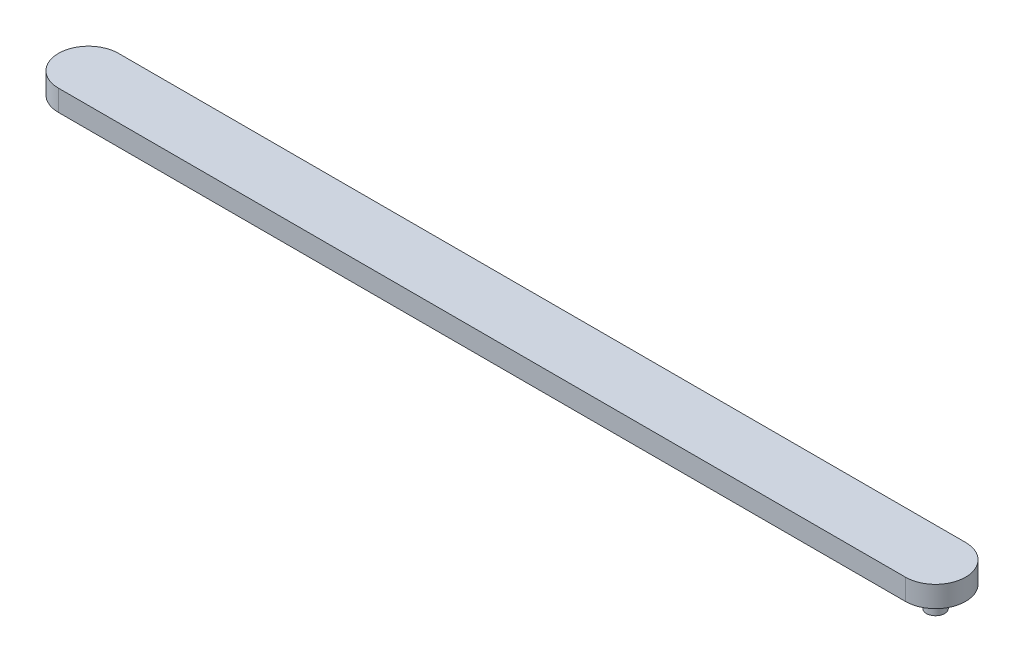
ISO-10303-21;
HEADER;
FILE_DESCRIPTION(('STEP AP214'),'2;1');
FILE_NAME('part.step','',(''),(''),'','','');
FILE_SCHEMA(('AUTOMOTIVE_DESIGN { 1 0 10303 214 1 1 1 1 }'));
ENDSEC;
DATA;
#1=APPLICATION_CONTEXT('core data for automotive mechanical design processes');
#2=APPLICATION_PROTOCOL_DEFINITION('international standard','automotive_design',2000,#1);
#3=PRODUCT_CONTEXT('',#1,'mechanical');
#4=PRODUCT('Part','Part','',(#3));
#5=PRODUCT_RELATED_PRODUCT_CATEGORY('part','',(#4));
#6=PRODUCT_DEFINITION_FORMATION('','',#4);
#7=PRODUCT_DEFINITION_CONTEXT('part definition',#1,'design');
#8=PRODUCT_DEFINITION('design','',#6,#7);
#9=PRODUCT_DEFINITION_SHAPE('','',#8);
#10=(LENGTH_UNIT() NAMED_UNIT(*) SI_UNIT(.MILLI.,.METRE.));
#11=(NAMED_UNIT(*) PLANE_ANGLE_UNIT() SI_UNIT($,.RADIAN.));
#12=(NAMED_UNIT(*) SI_UNIT($,.STERADIAN.) SOLID_ANGLE_UNIT());
#13=UNCERTAINTY_MEASURE_WITH_UNIT(LENGTH_MEASURE(1.E-05),#10,'distance_accuracy_value','');
#14=(GEOMETRIC_REPRESENTATION_CONTEXT(3) GLOBAL_UNCERTAINTY_ASSIGNED_CONTEXT((#13)) GLOBAL_UNIT_ASSIGNED_CONTEXT((#10,
#11,#12)) REPRESENTATION_CONTEXT('',''));
#15=CARTESIAN_POINT('',(0.,0.,0.));
#16=DIRECTION('',(0.,0.,1.));
#17=DIRECTION('',(1.,0.,0.));
#18=AXIS2_PLACEMENT_3D('',#15,#16,#17);
#19=CARTESIAN_POINT('',(0.,-5.5,100.));
#20=DIRECTION('',(0.,0.,-1.));
#21=DIRECTION('',(-1.,0.,0.));
#22=AXIS2_PLACEMENT_3D('',#19,#20,#21);
#23=PLANE('',#22);
#24=DIRECTION('',(1.,0.,0.));
#25=VECTOR('',#24,1.);
#26=CARTESIAN_POINT('',(0.,-9.,100.));
#27=LINE('',#26,#25);
#28=CARTESIAN_POINT('',(-70.3999999999999,-9.,100.));
#29=VERTEX_POINT('',#28);
#30=CARTESIAN_POINT('',(70.3999999999999,-9.,100.));
#31=VERTEX_POINT('',#30);
#32=EDGE_CURVE('E106',#29,#31,#27,.T.);
#33=ORIENTED_EDGE('',*,*,#32,.T.);
#34=DIRECTION('',(0.,-1.,0.));
#35=VECTOR('',#34,1.);
#36=CARTESIAN_POINT('',(70.3999999999999,-5.5,100.));
#37=LINE('',#36,#35);
#38=CARTESIAN_POINT('',(70.3999999999999,-5.5,100.));
#39=VERTEX_POINT('',#38);
#40=EDGE_CURVE('E11',#39,#31,#37,.T.);
#41=ORIENTED_EDGE('',*,*,#40,.F.);
#42=DIRECTION('',(1.,0.,0.));
#43=VECTOR('',#42,1.);
#44=CARTESIAN_POINT('',(0.,-5.5,100.));
#45=LINE('',#44,#43);
#46=CARTESIAN_POINT('',(-70.3999999999999,-5.5,100.));
#47=VERTEX_POINT('',#46);
#48=EDGE_CURVE('E91',#47,#39,#45,.T.);
#49=ORIENTED_EDGE('',*,*,#48,.F.);
#50=DIRECTION('',(0.,-1.,0.));
#51=VECTOR('',#50,1.);
#52=CARTESIAN_POINT('',(-70.3999999999999,-5.5,100.));
#53=LINE('',#52,#51);
#54=EDGE_CURVE('E102',#47,#29,#53,.T.);
#55=ORIENTED_EDGE('',*,*,#54,.T.);
#56=EDGE_LOOP('',(#33,#41,#49,#55));
#57=FACE_BOUND('',#56,.T.);
#58=ADVANCED_FACE('F44',(#57),#23,.F.);
#59=CARTESIAN_POINT('',(70.3999999999999,-5.5,95.));
#60=DIRECTION('',(0.,-1.,0.));
#61=DIRECTION('',(0.,0.,-1.));
#62=AXIS2_PLACEMENT_3D('',#59,#60,#61);
#63=CYLINDRICAL_SURFACE('',#62,4.99999999999999);
#64=CARTESIAN_POINT('',(70.3999999999999,-9.,95.));
#65=DIRECTION('',(0.,1.,0.));
#66=DIRECTION('',(0.,0.,1.));
#67=AXIS2_PLACEMENT_3D('',#64,#65,#66);
#68=CIRCLE('',#67,4.99999999999999);
#69=CARTESIAN_POINT('',(70.3999999999999,-9.,90.));
#70=VERTEX_POINT('',#69);
#71=EDGE_CURVE('E96',#31,#70,#68,.T.);
#72=ORIENTED_EDGE('',*,*,#71,.T.);
#73=DIRECTION('',(0.,-1.,0.));
#74=VECTOR('',#73,1.);
#75=CARTESIAN_POINT('',(70.3999999999999,-5.5,90.));
#76=LINE('',#75,#74);
#77=CARTESIAN_POINT('',(70.3999999999999,-5.5,90.));
#78=VERTEX_POINT('',#77);
#79=EDGE_CURVE('E52',#78,#70,#76,.T.);
#80=ORIENTED_EDGE('',*,*,#79,.F.);
#81=CARTESIAN_POINT('',(70.3999999999999,-5.5,95.));
#82=DIRECTION('',(0.,1.,0.));
#83=DIRECTION('',(0.,0.,1.));
#84=AXIS2_PLACEMENT_3D('',#81,#82,#83);
#85=CIRCLE('',#84,4.99999999999999);
#86=EDGE_CURVE('E86',#39,#78,#85,.T.);
#87=ORIENTED_EDGE('',*,*,#86,.F.);
#88=ORIENTED_EDGE('',*,*,#40,.T.);
#89=EDGE_LOOP('',(#72,#80,#87,#88));
#90=FACE_BOUND('',#89,.T.);
#91=ADVANCED_FACE('F95',(#90),#63,.T.);
#92=CARTESIAN_POINT('',(0.,-5.5,90.));
#93=DIRECTION('',(0.,0.,-1.));
#94=DIRECTION('',(-1.,0.,0.));
#95=AXIS2_PLACEMENT_3D('',#92,#93,#94);
#96=PLANE('',#95);
#97=DIRECTION('',(1.,0.,0.));
#98=VECTOR('',#97,1.);
#99=CARTESIAN_POINT('',(0.,-9.,90.));
#100=LINE('',#99,#98);
#101=CARTESIAN_POINT('',(-70.3999999999999,-9.,90.));
#102=VERTEX_POINT('',#101);
#103=EDGE_CURVE('E111',#102,#70,#100,.T.);
#104=ORIENTED_EDGE('',*,*,#103,.F.);
#105=DIRECTION('',(0.,-1.,0.));
#106=VECTOR('',#105,1.);
#107=CARTESIAN_POINT('',(-70.3999999999999,-5.5,90.));
#108=LINE('',#107,#106);
#109=CARTESIAN_POINT('',(-70.3999999999999,-5.5,90.));
#110=VERTEX_POINT('',#109);
#111=EDGE_CURVE('E76',#110,#102,#108,.T.);
#112=ORIENTED_EDGE('',*,*,#111,.F.);
#113=DIRECTION('',(1.,0.,0.));
#114=VECTOR('',#113,1.);
#115=CARTESIAN_POINT('',(0.,-5.5,90.));
#116=LINE('',#115,#114);
#117=EDGE_CURVE('E89',#110,#78,#116,.T.);
#118=ORIENTED_EDGE('',*,*,#117,.T.);
#119=ORIENTED_EDGE('',*,*,#79,.T.);
#120=EDGE_LOOP('',(#104,#112,#118,#119));
#121=FACE_BOUND('',#120,.T.);
#122=ADVANCED_FACE('F100',(#121),#96,.T.);
#123=CARTESIAN_POINT('',(-70.3999999999999,-5.5,95.));
#124=DIRECTION('',(0.,-1.,0.));
#125=DIRECTION('',(0.,0.,-1.));
#126=AXIS2_PLACEMENT_3D('',#123,#124,#125);
#127=CYLINDRICAL_SURFACE('',#126,4.99999999999999);
#128=CARTESIAN_POINT('',(-70.3999999999999,-9.,95.));
#129=DIRECTION('',(0.,1.,0.));
#130=DIRECTION('',(0.,0.,1.));
#131=AXIS2_PLACEMENT_3D('',#128,#129,#130);
#132=CIRCLE('',#131,4.99999999999999);
#133=EDGE_CURVE('E79',#102,#29,#132,.T.);
#134=ORIENTED_EDGE('',*,*,#133,.T.);
#135=ORIENTED_EDGE('',*,*,#54,.F.);
#136=CARTESIAN_POINT('',(-70.3999999999999,-5.5,95.));
#137=DIRECTION('',(0.,1.,0.));
#138=DIRECTION('',(0.,0.,1.));
#139=AXIS2_PLACEMENT_3D('',#136,#137,#138);
#140=CIRCLE('',#139,4.99999999999999);
#141=EDGE_CURVE('E60',#110,#47,#140,.T.);
#142=ORIENTED_EDGE('',*,*,#141,.F.);
#143=ORIENTED_EDGE('',*,*,#111,.T.);
#144=EDGE_LOOP('',(#134,#135,#142,#143));
#145=FACE_BOUND('',#144,.T.);
#146=ADVANCED_FACE('F131',(#145),#127,.T.);
#147=CARTESIAN_POINT('',(0.,-5.5,0.));
#148=DIRECTION('',(0.,1.,0.));
#149=DIRECTION('',(0.,0.,1.));
#150=AXIS2_PLACEMENT_3D('',#147,#148,#149);
#151=PLANE('',#150);
#152=ORIENTED_EDGE('',*,*,#48,.T.);
#153=ORIENTED_EDGE('',*,*,#86,.T.);
#154=ORIENTED_EDGE('',*,*,#117,.F.);
#155=ORIENTED_EDGE('',*,*,#141,.T.);
#156=EDGE_LOOP('',(#152,#153,#154,#155));
#157=FACE_BOUND('',#156,.T.);
#158=ADVANCED_FACE('F87',(#157),#151,.T.);
#159=CARTESIAN_POINT('',(0.,-9.,0.));
#160=DIRECTION('',(0.,1.,0.));
#161=DIRECTION('',(0.,0.,1.));
#162=AXIS2_PLACEMENT_3D('',#159,#160,#161);
#163=PLANE('',#162);
#164=CARTESIAN_POINT('',(70.3999999999999,-9.,95.));
#165=DIRECTION('',(0.,1.,0.));
#166=DIRECTION('',(0.,0.,1.));
#167=AXIS2_PLACEMENT_3D('',#164,#165,#166);
#168=CIRCLE('',#167,1.5);
#169=CARTESIAN_POINT('',(70.3999999999999,-9.,96.5));
#170=VERTEX_POINT('',#169);
#171=EDGE_CURVE('E221',#170,#170,#168,.T.);
#172=ORIENTED_EDGE('',*,*,#171,.T.);
#173=EDGE_LOOP('',(#172));
#174=FACE_BOUND('',#173,.T.);
#175=CARTESIAN_POINT('',(-70.3999999999999,-9.,95.));
#176=DIRECTION('',(0.,1.,0.));
#177=DIRECTION('',(0.,0.,1.));
#178=AXIS2_PLACEMENT_3D('',#175,#176,#177);
#179=CIRCLE('',#178,1.5);
#180=CARTESIAN_POINT('',(-70.3999999999999,-9.,96.5));
#181=VERTEX_POINT('',#180);
#182=EDGE_CURVE('E223',#181,#181,#179,.T.);
#183=ORIENTED_EDGE('',*,*,#182,.T.);
#184=EDGE_LOOP('',(#183));
#185=FACE_BOUND('',#184,.T.);
#186=ORIENTED_EDGE('',*,*,#32,.F.);
#187=ORIENTED_EDGE('',*,*,#133,.F.);
#188=ORIENTED_EDGE('',*,*,#103,.T.);
#189=ORIENTED_EDGE('',*,*,#71,.F.);
#190=EDGE_LOOP('',(#186,#187,#188,#189));
#191=FACE_BOUND('',#190,.T.);
#192=ADVANCED_FACE('F118',(#174,#185,#191),#163,.F.);
#193=CARTESIAN_POINT('',(-70.3999999999999,-12.5,95.));
#194=DIRECTION('',(0.,1.,0.));
#195=DIRECTION('',(0.,0.,1.));
#196=AXIS2_PLACEMENT_3D('',#193,#194,#195);
#197=CYLINDRICAL_SURFACE('',#196,1.5);
#198=CARTESIAN_POINT('',(-70.3999999999999,-12.5,95.));
#199=DIRECTION('',(0.,1.,0.));
#200=DIRECTION('',(0.,0.,1.));
#201=AXIS2_PLACEMENT_3D('',#198,#199,#200);
#202=CIRCLE('',#201,1.5);
#203=CARTESIAN_POINT('',(-70.3999999999999,-12.5,96.5));
#204=VERTEX_POINT('',#203);
#205=EDGE_CURVE('E109',#204,#204,#202,.T.);
#206=ORIENTED_EDGE('',*,*,#205,.T.);
#207=EDGE_LOOP('',(#206));
#208=FACE_BOUND('',#207,.T.);
#209=ORIENTED_EDGE('',*,*,#182,.F.);
#210=EDGE_LOOP('',(#209));
#211=FACE_BOUND('',#210,.T.);
#212=ADVANCED_FACE('F120',(#208,#211),#197,.T.);
#213=CARTESIAN_POINT('',(0.,-12.5,0.));
#214=DIRECTION('',(0.,1.,0.));
#215=DIRECTION('',(0.,0.,1.));
#216=AXIS2_PLACEMENT_3D('',#213,#214,#215);
#217=PLANE('',#216);
#218=ORIENTED_EDGE('',*,*,#205,.F.);
#219=EDGE_LOOP('',(#218));
#220=FACE_BOUND('',#219,.T.);
#221=ADVANCED_FACE('F127',(#220),#217,.F.);
#222=CARTESIAN_POINT('',(70.3999999999999,-12.5,95.));
#223=DIRECTION('',(0.,1.,0.));
#224=DIRECTION('',(0.,0.,1.));
#225=AXIS2_PLACEMENT_3D('',#222,#223,#224);
#226=CYLINDRICAL_SURFACE('',#225,1.5);
#227=CARTESIAN_POINT('',(70.3999999999999,-12.5,95.));
#228=DIRECTION('',(0.,1.,0.));
#229=DIRECTION('',(0.,0.,1.));
#230=AXIS2_PLACEMENT_3D('',#227,#228,#229);
#231=CIRCLE('',#230,1.5);
#232=CARTESIAN_POINT('',(70.3999999999999,-12.5,96.5));
#233=VERTEX_POINT('',#232);
#234=EDGE_CURVE('E220',#233,#233,#231,.T.);
#235=ORIENTED_EDGE('',*,*,#234,.T.);
#236=EDGE_LOOP('',(#235));
#237=FACE_BOUND('',#236,.T.);
#238=ORIENTED_EDGE('',*,*,#171,.F.);
#239=EDGE_LOOP('',(#238));
#240=FACE_BOUND('',#239,.T.);
#241=ADVANCED_FACE('F180',(#237,#240),#226,.T.);
#242=CARTESIAN_POINT('',(70.3999999999999,-12.5,95.));
#243=DIRECTION('',(0.,1.,0.));
#244=DIRECTION('',(0.,0.,1.));
#245=AXIS2_PLACEMENT_3D('',#242,#243,#244);
#246=PLANE('',#245);
#247=ORIENTED_EDGE('',*,*,#234,.F.);
#248=EDGE_LOOP('',(#247));
#249=FACE_BOUND('',#248,.T.);
#250=ADVANCED_FACE('F189',(#249),#246,.F.);
#251=CLOSED_SHELL('',(#58,#91,#122,#146,#158,#192,#212,#221,#241,#250));
#252=MANIFOLD_SOLID_BREP('B2',#251);
#253=ADVANCED_BREP_SHAPE_REPRESENTATION('',(#18,#252),#14);
#254=SHAPE_DEFINITION_REPRESENTATION(#9,#253);
ENDSEC;
END-ISO-10303-21;
